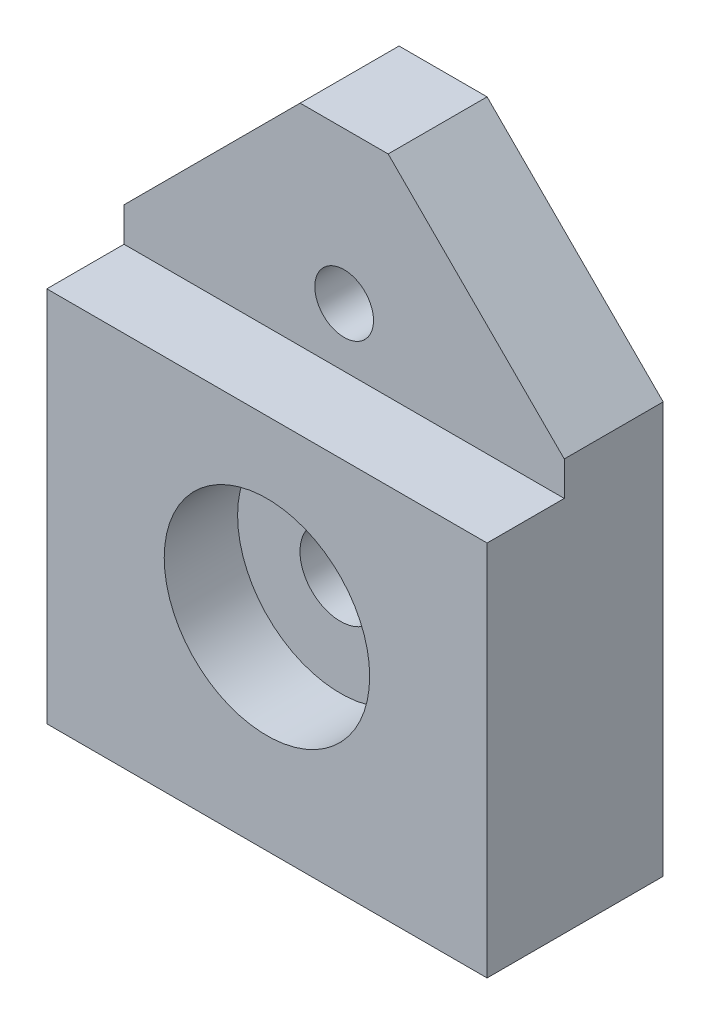
ISO-10303-21;
HEADER;
FILE_DESCRIPTION(('STEP AP214'),'2;1');
FILE_NAME('part.step','',(''),(''),'','','');
FILE_SCHEMA(('AUTOMOTIVE_DESIGN { 1 0 10303 214 1 1 1 1 }'));
ENDSEC;
DATA;
#1=APPLICATION_CONTEXT('core data for automotive mechanical design processes');
#2=APPLICATION_PROTOCOL_DEFINITION('international standard','automotive_design',2000,#1);
#3=PRODUCT_CONTEXT('',#1,'mechanical');
#4=PRODUCT('Part','Part','',(#3));
#5=PRODUCT_RELATED_PRODUCT_CATEGORY('part','',(#4));
#6=PRODUCT_DEFINITION_FORMATION('','',#4);
#7=PRODUCT_DEFINITION_CONTEXT('part definition',#1,'design');
#8=PRODUCT_DEFINITION('design','',#6,#7);
#9=PRODUCT_DEFINITION_SHAPE('','',#8);
#10=(LENGTH_UNIT() NAMED_UNIT(*) SI_UNIT(.MILLI.,.METRE.));
#11=(NAMED_UNIT(*) PLANE_ANGLE_UNIT() SI_UNIT($,.RADIAN.));
#12=(NAMED_UNIT(*) SI_UNIT($,.STERADIAN.) SOLID_ANGLE_UNIT());
#13=UNCERTAINTY_MEASURE_WITH_UNIT(LENGTH_MEASURE(1.E-05),#10,'distance_accuracy_value','');
#14=(GEOMETRIC_REPRESENTATION_CONTEXT(3) GLOBAL_UNCERTAINTY_ASSIGNED_CONTEXT((#13)) GLOBAL_UNIT_ASSIGNED_CONTEXT((#10,
#11,#12)) REPRESENTATION_CONTEXT('',''));
#15=CARTESIAN_POINT('',(0.,0.,0.));
#16=DIRECTION('',(0.,0.,1.));
#17=DIRECTION('',(1.,0.,0.));
#18=AXIS2_PLACEMENT_3D('',#15,#16,#17);
#19=CARTESIAN_POINT('',(66.0447711656927,-53.1219230769231,12.));
#20=DIRECTION('',(0.,0.,1.));
#21=DIRECTION('',(1.,0.,0.));
#22=AXIS2_PLACEMENT_3D('',#19,#20,#21);
#23=CYLINDRICAL_SURFACE('',#22,2.75);
#24=CARTESIAN_POINT('',(66.0447711656927,-53.1219230769231,0.));
#25=DIRECTION('',(0.,0.,-1.));
#26=DIRECTION('',(-1.,0.,0.));
#27=AXIS2_PLACEMENT_3D('',#24,#25,#26);
#28=CIRCLE('',#27,2.75);
#29=CARTESIAN_POINT('',(63.2947711656927,-53.1219230769231,0.));
#30=VERTEX_POINT('',#29);
#31=EDGE_CURVE('E109',#30,#30,#28,.T.);
#32=ORIENTED_EDGE('',*,*,#31,.T.);
#33=EDGE_LOOP('',(#32));
#34=FACE_BOUND('',#33,.T.);
#35=CARTESIAN_POINT('',(66.0447711656927,-53.1219230769231,7.));
#36=DIRECTION('',(0.,0.,1.));
#37=DIRECTION('',(1.,0.,0.));
#38=AXIS2_PLACEMENT_3D('',#35,#36,#37);
#39=CIRCLE('',#38,2.75);
#40=CARTESIAN_POINT('',(68.7947711656927,-53.1219230769231,7.));
#41=VERTEX_POINT('',#40);
#42=EDGE_CURVE('E35',#41,#41,#39,.F.);
#43=ORIENTED_EDGE('',*,*,#42,.F.);
#44=EDGE_LOOP('',(#43));
#45=FACE_BOUND('',#44,.T.);
#46=ADVANCED_FACE('F31',(#34,#45),#23,.F.);
#47=CARTESIAN_POINT('',(51.0447711656927,-26.9219230769231,12.));
#48=DIRECTION('',(0.,0.,-1.));
#49=DIRECTION('',(-1.,0.,0.));
#50=AXIS2_PLACEMENT_3D('',#47,#48,#49);
#51=PLANE('',#50);
#52=CARTESIAN_POINT('',(66.0447711656927,-53.1219230769231,12.));
#53=DIRECTION('',(0.,0.,1.));
#54=DIRECTION('',(1.,0.,0.));
#55=AXIS2_PLACEMENT_3D('',#52,#53,#54);
#56=CIRCLE('',#55,7.);
#57=CARTESIAN_POINT('',(73.0447711656927,-53.1219230769231,12.));
#58=VERTEX_POINT('',#57);
#59=EDGE_CURVE('E167',#58,#58,#56,.T.);
#60=ORIENTED_EDGE('',*,*,#59,.F.);
#61=EDGE_LOOP('',(#60));
#62=FACE_BOUND('',#61,.T.);
#63=DIRECTION('',(0.,1.,0.));
#64=VECTOR('',#63,1.);
#65=CARTESIAN_POINT('',(81.0447711656927,-66.9219230769231,12.));
#66=LINE('',#65,#64);
#67=CARTESIAN_POINT('',(81.0447711656927,-66.9219230769231,12.));
#68=VERTEX_POINT('',#67);
#69=CARTESIAN_POINT('',(81.0447711656927,-41.2511107112472,12.));
#70=VERTEX_POINT('',#69);
#71=EDGE_CURVE('E94',#68,#70,#66,.T.);
#72=ORIENTED_EDGE('',*,*,#71,.T.);
#73=DIRECTION('',(1.,0.,0.));
#74=VECTOR('',#73,1.);
#75=CARTESIAN_POINT('',(81.0447711656927,-41.2511107112472,12.));
#76=LINE('',#75,#74);
#77=CARTESIAN_POINT('',(51.0447711656927,-41.2511107112472,12.));
#78=VERTEX_POINT('',#77);
#79=EDGE_CURVE('E165',#78,#70,#76,.T.);
#80=ORIENTED_EDGE('',*,*,#79,.F.);
#81=DIRECTION('',(0.,-1.,0.));
#82=VECTOR('',#81,1.);
#83=CARTESIAN_POINT('',(51.0447711656927,-66.9219230769231,12.));
#84=LINE('',#83,#82);
#85=CARTESIAN_POINT('',(51.0447711656927,-66.9219230769231,12.));
#86=VERTEX_POINT('',#85);
#87=EDGE_CURVE('E103',#78,#86,#84,.T.);
#88=ORIENTED_EDGE('',*,*,#87,.T.);
#89=DIRECTION('',(1.,0.,0.));
#90=VECTOR('',#89,1.);
#91=CARTESIAN_POINT('',(51.0447711656927,-66.9219230769231,12.));
#92=LINE('',#91,#90);
#93=EDGE_CURVE('E56',#86,#68,#92,.T.);
#94=ORIENTED_EDGE('',*,*,#93,.T.);
#95=EDGE_LOOP('',(#72,#80,#88,#94));
#96=FACE_BOUND('',#95,.T.);
#97=ADVANCED_FACE('F170',(#62,#96),#51,.F.);
#98=CARTESIAN_POINT('',(51.0447711656927,-66.9219230769231,12.));
#99=DIRECTION('',(1.,0.,0.));
#100=DIRECTION('',(0.,0.,-1.));
#101=AXIS2_PLACEMENT_3D('',#98,#99,#100);
#102=PLANE('',#101);
#103=ORIENTED_EDGE('',*,*,#87,.F.);
#104=DIRECTION('',(0.,0.,1.));
#105=VECTOR('',#104,1.);
#106=CARTESIAN_POINT('',(51.0447711656927,-41.2511107112472,6.74));
#107=LINE('',#106,#105);
#108=CARTESIAN_POINT('',(51.0447711656927,-41.2511107112472,6.74));
#109=VERTEX_POINT('',#108);
#110=EDGE_CURVE('E162',#109,#78,#107,.T.);
#111=ORIENTED_EDGE('',*,*,#110,.F.);
#112=DIRECTION('',(0.,-1.,0.));
#113=VECTOR('',#112,1.);
#114=CARTESIAN_POINT('',(51.0447711656927,-41.2511107112472,6.74));
#115=LINE('',#114,#113);
#116=CARTESIAN_POINT('',(51.0447711656927,-38.9219230769231,6.74));
#117=VERTEX_POINT('',#116);
#118=EDGE_CURVE('E91',#117,#109,#115,.T.);
#119=ORIENTED_EDGE('',*,*,#118,.F.);
#120=DIRECTION('',(0.,0.,-1.));
#121=VECTOR('',#120,1.);
#122=CARTESIAN_POINT('',(51.0447711656927,-38.9219230769231,12.));
#123=LINE('',#122,#121);
#124=CARTESIAN_POINT('',(51.0447711656927,-38.9219230769231,0.));
#125=VERTEX_POINT('',#124);
#126=EDGE_CURVE('E82',#117,#125,#123,.T.);
#127=ORIENTED_EDGE('',*,*,#126,.T.);
#128=DIRECTION('',(0.,-1.,0.));
#129=VECTOR('',#128,1.);
#130=CARTESIAN_POINT('',(51.0447711656927,-66.9219230769231,0.));
#131=LINE('',#130,#129);
#132=CARTESIAN_POINT('',(51.0447711656927,-66.9219230769231,0.));
#133=VERTEX_POINT('',#132);
#134=EDGE_CURVE('E87',#125,#133,#131,.T.);
#135=ORIENTED_EDGE('',*,*,#134,.T.);
#136=DIRECTION('',(0.,0.,-1.));
#137=VECTOR('',#136,1.);
#138=CARTESIAN_POINT('',(51.0447711656927,-66.9219230769231,12.));
#139=LINE('',#138,#137);
#140=EDGE_CURVE('E11',#86,#133,#139,.T.);
#141=ORIENTED_EDGE('',*,*,#140,.F.);
#142=EDGE_LOOP('',(#103,#111,#119,#127,#135,#141));
#143=FACE_BOUND('',#142,.T.);
#144=ADVANCED_FACE('F33',(#143),#102,.F.);
#145=CARTESIAN_POINT('',(51.0447711656927,-66.9219230769231,12.));
#146=DIRECTION('',(0.,1.,0.));
#147=DIRECTION('',(0.,0.,1.));
#148=AXIS2_PLACEMENT_3D('',#145,#146,#147);
#149=PLANE('',#148);
#150=DIRECTION('',(1.,0.,0.));
#151=VECTOR('',#150,1.);
#152=CARTESIAN_POINT('',(51.0447711656927,-66.9219230769231,0.));
#153=LINE('',#152,#151);
#154=CARTESIAN_POINT('',(81.0447711656927,-66.9219230769231,0.));
#155=VERTEX_POINT('',#154);
#156=EDGE_CURVE('E108',#133,#155,#153,.T.);
#157=ORIENTED_EDGE('',*,*,#156,.T.);
#158=DIRECTION('',(0.,0.,-1.));
#159=VECTOR('',#158,1.);
#160=CARTESIAN_POINT('',(81.0447711656927,-66.9219230769231,12.));
#161=LINE('',#160,#159);
#162=EDGE_CURVE('E40',#68,#155,#161,.T.);
#163=ORIENTED_EDGE('',*,*,#162,.F.);
#164=ORIENTED_EDGE('',*,*,#93,.F.);
#165=ORIENTED_EDGE('',*,*,#140,.T.);
#166=EDGE_LOOP('',(#157,#163,#164,#165));
#167=FACE_BOUND('',#166,.T.);
#168=ADVANCED_FACE('F266',(#167),#149,.F.);
#169=CARTESIAN_POINT('',(81.0447711656927,-66.9219230769231,12.));
#170=DIRECTION('',(-1.,0.,0.));
#171=DIRECTION('',(0.,0.,1.));
#172=AXIS2_PLACEMENT_3D('',#169,#170,#171);
#173=PLANE('',#172);
#174=DIRECTION('',(0.,1.,0.));
#175=VECTOR('',#174,1.);
#176=CARTESIAN_POINT('',(81.0447711656927,-38.9219230769231,6.74));
#177=LINE('',#176,#175);
#178=CARTESIAN_POINT('',(81.0447711656927,-41.2511107112472,6.74));
#179=VERTEX_POINT('',#178);
#180=CARTESIAN_POINT('',(81.0447711656927,-38.9219230769231,6.74));
#181=VERTEX_POINT('',#180);
#182=EDGE_CURVE('E147',#179,#181,#177,.T.);
#183=ORIENTED_EDGE('',*,*,#182,.F.);
#184=DIRECTION('',(0.,0.,1.));
#185=VECTOR('',#184,1.);
#186=CARTESIAN_POINT('',(81.0447711656927,-41.2511107112472,6.74));
#187=LINE('',#186,#185);
#188=EDGE_CURVE('E168',#179,#70,#187,.T.);
#189=ORIENTED_EDGE('',*,*,#188,.T.);
#190=ORIENTED_EDGE('',*,*,#71,.F.);
#191=ORIENTED_EDGE('',*,*,#162,.T.);
#192=DIRECTION('',(0.,1.,0.));
#193=VECTOR('',#192,1.);
#194=CARTESIAN_POINT('',(81.0447711656927,-66.9219230769231,0.));
#195=LINE('',#194,#193);
#196=CARTESIAN_POINT('',(81.0447711656927,-38.9219230769231,0.));
#197=VERTEX_POINT('',#196);
#198=EDGE_CURVE('E111',#155,#197,#195,.T.);
#199=ORIENTED_EDGE('',*,*,#198,.T.);
#200=DIRECTION('',(0.,0.,-1.));
#201=VECTOR('',#200,1.);
#202=CARTESIAN_POINT('',(81.0447711656927,-38.9219230769231,12.));
#203=LINE('',#202,#201);
#204=EDGE_CURVE('E127',#181,#197,#203,.T.);
#205=ORIENTED_EDGE('',*,*,#204,.F.);
#206=EDGE_LOOP('',(#183,#189,#190,#191,#199,#205));
#207=FACE_BOUND('',#206,.T.);
#208=ADVANCED_FACE('F133',(#207),#173,.F.);
#209=CARTESIAN_POINT('',(69.0447711656927,-26.9219230769231,12.));
#210=DIRECTION('',(-0.707106781186548,-0.707106781186547,0.));
#211=DIRECTION('',(0.707106781186547,-0.707106781186548,0.));
#212=AXIS2_PLACEMENT_3D('',#209,#210,#211);
#213=PLANE('',#212);
#214=DIRECTION('',(0.,0.,-1.));
#215=VECTOR('',#214,1.);
#216=CARTESIAN_POINT('',(69.0447711656927,-26.9219230769231,12.));
#217=LINE('',#216,#215);
#218=CARTESIAN_POINT('',(69.0447711656927,-26.9219230769231,6.74));
#219=VERTEX_POINT('',#218);
#220=CARTESIAN_POINT('',(69.0447711656927,-26.9219230769231,0.));
#221=VERTEX_POINT('',#220);
#222=EDGE_CURVE('E125',#219,#221,#217,.T.);
#223=ORIENTED_EDGE('',*,*,#222,.F.);
#224=DIRECTION('',(-0.707106781186547,0.707106781186548,0.));
#225=VECTOR('',#224,1.);
#226=CARTESIAN_POINT('',(69.0447711656927,-26.9219230769231,6.74));
#227=LINE('',#226,#225);
#228=EDGE_CURVE('E144',#181,#219,#227,.T.);
#229=ORIENTED_EDGE('',*,*,#228,.F.);
#230=ORIENTED_EDGE('',*,*,#204,.T.);
#231=DIRECTION('',(-0.707106781186547,0.707106781186548,0.));
#232=VECTOR('',#231,1.);
#233=CARTESIAN_POINT('',(69.0447711656927,-26.9219230769231,0.));
#234=LINE('',#233,#232);
#235=EDGE_CURVE('E120',#197,#221,#234,.T.);
#236=ORIENTED_EDGE('',*,*,#235,.T.);
#237=EDGE_LOOP('',(#223,#229,#230,#236));
#238=FACE_BOUND('',#237,.T.);
#239=ADVANCED_FACE('F140',(#238),#213,.F.);
#240=CARTESIAN_POINT('',(63.0447711656927,-26.9219230769231,12.));
#241=DIRECTION('',(0.,-1.,0.));
#242=DIRECTION('',(0.,0.,-1.));
#243=AXIS2_PLACEMENT_3D('',#240,#241,#242);
#244=PLANE('',#243);
#245=DIRECTION('',(0.,0.,-1.));
#246=VECTOR('',#245,1.);
#247=CARTESIAN_POINT('',(63.0447711656927,-26.9219230769231,12.));
#248=LINE('',#247,#246);
#249=CARTESIAN_POINT('',(63.0447711656927,-26.9219230769231,6.74));
#250=VERTEX_POINT('',#249);
#251=CARTESIAN_POINT('',(63.0447711656927,-26.9219230769231,0.));
#252=VERTEX_POINT('',#251);
#253=EDGE_CURVE('E93',#250,#252,#248,.T.);
#254=ORIENTED_EDGE('',*,*,#253,.F.);
#255=DIRECTION('',(-1.,0.,0.));
#256=VECTOR('',#255,1.);
#257=CARTESIAN_POINT('',(63.0447711656927,-26.9219230769231,6.74));
#258=LINE('',#257,#256);
#259=EDGE_CURVE('E47',#219,#250,#258,.T.);
#260=ORIENTED_EDGE('',*,*,#259,.F.);
#261=ORIENTED_EDGE('',*,*,#222,.T.);
#262=DIRECTION('',(-1.,0.,0.));
#263=VECTOR('',#262,1.);
#264=CARTESIAN_POINT('',(63.0447711656927,-26.9219230769231,0.));
#265=LINE('',#264,#263);
#266=EDGE_CURVE('E104',#221,#252,#265,.T.);
#267=ORIENTED_EDGE('',*,*,#266,.T.);
#268=EDGE_LOOP('',(#254,#260,#261,#267));
#269=FACE_BOUND('',#268,.T.);
#270=ADVANCED_FACE('F200',(#269),#244,.F.);
#271=CARTESIAN_POINT('',(51.0447711656927,-38.9219230769231,12.));
#272=DIRECTION('',(0.707106781186547,-0.707106781186547,0.));
#273=DIRECTION('',(0.707106781186548,0.707106781186548,0.));
#274=AXIS2_PLACEMENT_3D('',#271,#272,#273);
#275=PLANE('',#274);
#276=ORIENTED_EDGE('',*,*,#126,.F.);
#277=DIRECTION('',(-0.707106781186548,-0.707106781186548,0.));
#278=VECTOR('',#277,1.);
#279=CARTESIAN_POINT('',(51.0447711656927,-38.9219230769231,6.74));
#280=LINE('',#279,#278);
#281=EDGE_CURVE('E182',#250,#117,#280,.T.);
#282=ORIENTED_EDGE('',*,*,#281,.F.);
#283=ORIENTED_EDGE('',*,*,#253,.T.);
#284=DIRECTION('',(-0.707106781186548,-0.707106781186548,0.));
#285=VECTOR('',#284,1.);
#286=CARTESIAN_POINT('',(51.0447711656927,-38.9219230769231,0.));
#287=LINE('',#286,#285);
#288=EDGE_CURVE('E97',#252,#125,#287,.T.);
#289=ORIENTED_EDGE('',*,*,#288,.T.);
#290=EDGE_LOOP('',(#276,#282,#283,#289));
#291=FACE_BOUND('',#290,.T.);
#292=ADVANCED_FACE('F98',(#291),#275,.F.);
#293=CARTESIAN_POINT('',(51.0447711656927,-26.9219230769231,0.));
#294=DIRECTION('',(0.,0.,-1.));
#295=DIRECTION('',(-1.,0.,0.));
#296=AXIS2_PLACEMENT_3D('',#293,#294,#295);
#297=PLANE('',#296);
#298=CARTESIAN_POINT('',(66.0447711656927,-37.2511107112472,0.));
#299=DIRECTION('',(0.,0.,1.));
#300=DIRECTION('',(1.,0.,0.));
#301=AXIS2_PLACEMENT_3D('',#298,#299,#300);
#302=CIRCLE('',#301,2.);
#303=CARTESIAN_POINT('',(68.0447711656927,-37.2511107112472,0.));
#304=VERTEX_POINT('',#303);
#305=EDGE_CURVE('E171',#304,#304,#302,.T.);
#306=ORIENTED_EDGE('',*,*,#305,.T.);
#307=EDGE_LOOP('',(#306));
#308=FACE_BOUND('',#307,.T.);
#309=ORIENTED_EDGE('',*,*,#31,.F.);
#310=EDGE_LOOP('',(#309));
#311=FACE_BOUND('',#310,.T.);
#312=ORIENTED_EDGE('',*,*,#134,.F.);
#313=ORIENTED_EDGE('',*,*,#288,.F.);
#314=ORIENTED_EDGE('',*,*,#266,.F.);
#315=ORIENTED_EDGE('',*,*,#235,.F.);
#316=ORIENTED_EDGE('',*,*,#198,.F.);
#317=ORIENTED_EDGE('',*,*,#156,.F.);
#318=EDGE_LOOP('',(#312,#313,#314,#315,#316,#317));
#319=FACE_BOUND('',#318,.T.);
#320=ADVANCED_FACE('F106',(#308,#311,#319),#297,.T.);
#321=CARTESIAN_POINT('',(66.0447711656927,-53.1219230769231,7.));
#322=DIRECTION('',(0.,0.,1.));
#323=DIRECTION('',(1.,0.,0.));
#324=AXIS2_PLACEMENT_3D('',#321,#322,#323);
#325=PLANE('',#324);
#326=CARTESIAN_POINT('',(66.0447711656927,-53.1219230769231,7.));
#327=DIRECTION('',(0.,0.,1.));
#328=DIRECTION('',(1.,0.,0.));
#329=AXIS2_PLACEMENT_3D('',#326,#327,#328);
#330=CIRCLE('',#329,7.);
#331=CARTESIAN_POINT('',(73.0447711656927,-53.1219230769231,7.));
#332=VERTEX_POINT('',#331);
#333=EDGE_CURVE('E177',#332,#332,#330,.T.);
#334=ORIENTED_EDGE('',*,*,#333,.T.);
#335=EDGE_LOOP('',(#334));
#336=FACE_BOUND('',#335,.T.);
#337=ORIENTED_EDGE('',*,*,#42,.T.);
#338=EDGE_LOOP('',(#337));
#339=FACE_BOUND('',#338,.T.);
#340=ADVANCED_FACE('F223',(#336,#339),#325,.T.);
#341=CARTESIAN_POINT('',(66.0447711656927,-53.1219230769231,7.));
#342=DIRECTION('',(0.,0.,1.));
#343=DIRECTION('',(1.,0.,0.));
#344=AXIS2_PLACEMENT_3D('',#341,#342,#343);
#345=CYLINDRICAL_SURFACE('',#344,7.);
#346=ORIENTED_EDGE('',*,*,#333,.F.);
#347=EDGE_LOOP('',(#346));
#348=FACE_BOUND('',#347,.T.);
#349=ORIENTED_EDGE('',*,*,#59,.T.);
#350=EDGE_LOOP('',(#349));
#351=FACE_BOUND('',#350,.T.);
#352=ADVANCED_FACE('F219',(#348,#351),#345,.F.);
#353=CARTESIAN_POINT('',(81.0447711656927,-41.2511107112472,6.74));
#354=DIRECTION('',(0.,-1.,0.));
#355=DIRECTION('',(0.,0.,-1.));
#356=AXIS2_PLACEMENT_3D('',#353,#354,#355);
#357=PLANE('',#356);
#358=ORIENTED_EDGE('',*,*,#79,.T.);
#359=ORIENTED_EDGE('',*,*,#188,.F.);
#360=DIRECTION('',(1.,0.,0.));
#361=VECTOR('',#360,1.);
#362=CARTESIAN_POINT('',(81.0447711656927,-41.2511107112472,6.74));
#363=LINE('',#362,#361);
#364=EDGE_CURVE('E166',#109,#179,#363,.T.);
#365=ORIENTED_EDGE('',*,*,#364,.F.);
#366=ORIENTED_EDGE('',*,*,#110,.T.);
#367=EDGE_LOOP('',(#358,#359,#365,#366));
#368=FACE_BOUND('',#367,.T.);
#369=ADVANCED_FACE('F164',(#368),#357,.F.);
#370=CARTESIAN_POINT('',(51.0447711656927,-41.2511107112472,6.74));
#371=DIRECTION('',(0.,0.,-1.));
#372=DIRECTION('',(-1.,0.,0.));
#373=AXIS2_PLACEMENT_3D('',#370,#371,#372);
#374=PLANE('',#373);
#375=CARTESIAN_POINT('',(66.0447711656927,-37.2511107112472,6.74));
#376=DIRECTION('',(0.,0.,1.));
#377=DIRECTION('',(1.,0.,0.));
#378=AXIS2_PLACEMENT_3D('',#375,#376,#377);
#379=CIRCLE('',#378,2.);
#380=CARTESIAN_POINT('',(68.0447711656927,-37.2511107112472,6.74));
#381=VERTEX_POINT('',#380);
#382=EDGE_CURVE('E190',#381,#381,#379,.T.);
#383=ORIENTED_EDGE('',*,*,#382,.F.);
#384=EDGE_LOOP('',(#383));
#385=FACE_BOUND('',#384,.T.);
#386=ORIENTED_EDGE('',*,*,#364,.T.);
#387=ORIENTED_EDGE('',*,*,#182,.T.);
#388=ORIENTED_EDGE('',*,*,#228,.T.);
#389=ORIENTED_EDGE('',*,*,#259,.T.);
#390=ORIENTED_EDGE('',*,*,#281,.T.);
#391=ORIENTED_EDGE('',*,*,#118,.T.);
#392=EDGE_LOOP('',(#386,#387,#388,#389,#390,#391));
#393=FACE_BOUND('',#392,.T.);
#394=ADVANCED_FACE('F196',(#385,#393),#374,.F.);
#395=CARTESIAN_POINT('',(66.0447711656927,-37.2511107112472,6.74));
#396=DIRECTION('',(0.,0.,1.));
#397=DIRECTION('',(1.,0.,0.));
#398=AXIS2_PLACEMENT_3D('',#395,#396,#397);
#399=CYLINDRICAL_SURFACE('',#398,2.);
#400=ORIENTED_EDGE('',*,*,#305,.F.);
#401=EDGE_LOOP('',(#400));
#402=FACE_BOUND('',#401,.T.);
#403=ORIENTED_EDGE('',*,*,#382,.T.);
#404=EDGE_LOOP('',(#403));
#405=FACE_BOUND('',#404,.T.);
#406=ADVANCED_FACE('F194',(#402,#405),#399,.F.);
#407=CLOSED_SHELL('',(#46,#97,#144,#168,#208,#239,#270,#292,#320,#340,#352,#369,#394,#406));
#408=MANIFOLD_SOLID_BREP('B2',#407);
#409=ADVANCED_BREP_SHAPE_REPRESENTATION('',(#18,#408),#14);
#410=SHAPE_DEFINITION_REPRESENTATION(#9,#409);
ENDSEC;
END-ISO-10303-21;
